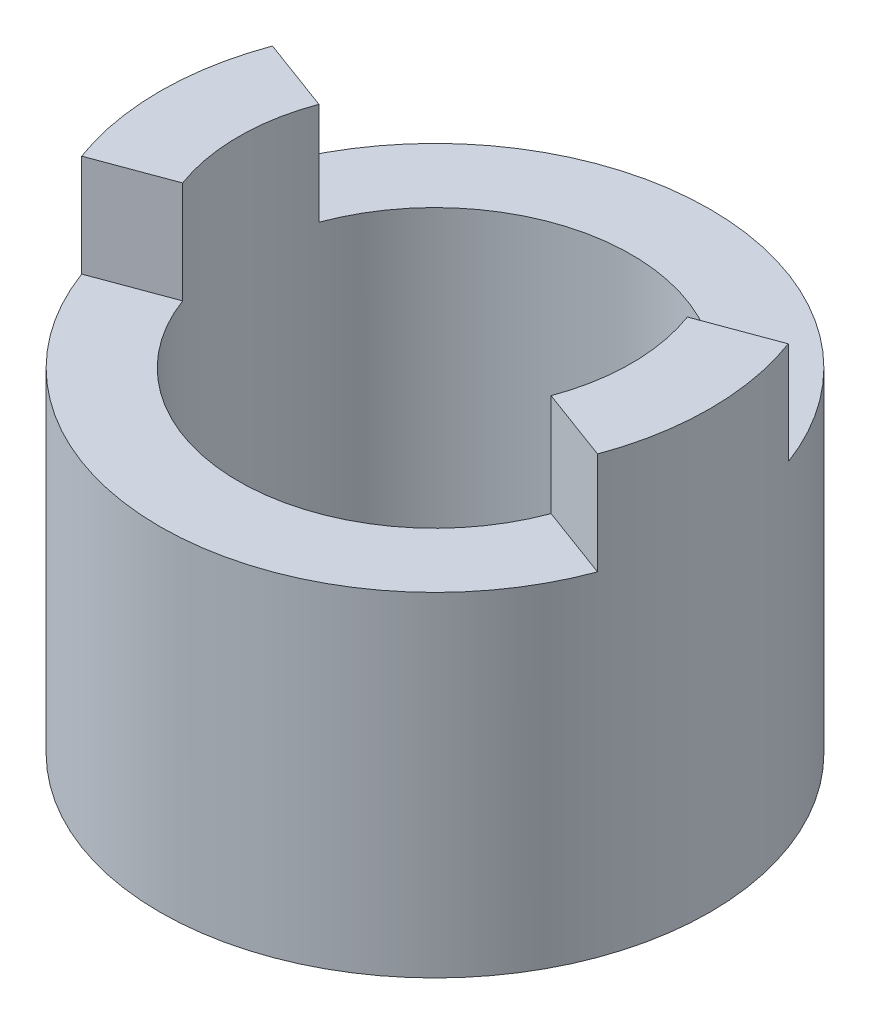
ISO-10303-21;
HEADER;
FILE_DESCRIPTION(('STEP AP214'),'2;1');
FILE_NAME('part.step','',(''),(''),'','','');
FILE_SCHEMA(('AUTOMOTIVE_DESIGN { 1 0 10303 214 1 1 1 1 }'));
ENDSEC;
DATA;
#1=APPLICATION_CONTEXT('core data for automotive mechanical design processes');
#2=APPLICATION_PROTOCOL_DEFINITION('international standard','automotive_design',2000,#1);
#3=PRODUCT_CONTEXT('',#1,'mechanical');
#4=PRODUCT('Part','Part','',(#3));
#5=PRODUCT_RELATED_PRODUCT_CATEGORY('part','',(#4));
#6=PRODUCT_DEFINITION_FORMATION('','',#4);
#7=PRODUCT_DEFINITION_CONTEXT('part definition',#1,'design');
#8=PRODUCT_DEFINITION('design','',#6,#7);
#9=PRODUCT_DEFINITION_SHAPE('','',#8);
#10=(LENGTH_UNIT() NAMED_UNIT(*) SI_UNIT(.MILLI.,.METRE.));
#11=(NAMED_UNIT(*) PLANE_ANGLE_UNIT() SI_UNIT($,.RADIAN.));
#12=(NAMED_UNIT(*) SI_UNIT($,.STERADIAN.) SOLID_ANGLE_UNIT());
#13=UNCERTAINTY_MEASURE_WITH_UNIT(LENGTH_MEASURE(1.E-05),#10,'distance_accuracy_value','');
#14=(GEOMETRIC_REPRESENTATION_CONTEXT(3) GLOBAL_UNCERTAINTY_ASSIGNED_CONTEXT((#13)) GLOBAL_UNIT_ASSIGNED_CONTEXT((#10,
#11,#12)) REPRESENTATION_CONTEXT('',''));
#15=CARTESIAN_POINT('',(0.,0.,0.));
#16=DIRECTION('',(0.,0.,1.));
#17=DIRECTION('',(1.,0.,0.));
#18=AXIS2_PLACEMENT_3D('',#15,#16,#17);
#19=CARTESIAN_POINT('',(0.,4.25,0.));
#20=DIRECTION('',(0.,1.,0.));
#21=DIRECTION('',(0.,0.,1.));
#22=AXIS2_PLACEMENT_3D('',#19,#20,#21);
#23=PLANE('',#22);
#24=CARTESIAN_POINT('',(0.,4.25,0.));
#25=DIRECTION('',(0.,1.,0.));
#26=DIRECTION('',(0.,0.,1.));
#27=AXIS2_PLACEMENT_3D('',#24,#25,#26);
#28=CIRCLE('',#27,2.5);
#29=CARTESIAN_POINT('',(-2.34475912302273,4.25,0.867239675638555));
#30=VERTEX_POINT('',#29);
#31=CARTESIAN_POINT('',(2.34475912302273,4.25,0.867239675638555));
#32=VERTEX_POINT('',#31);
#33=EDGE_CURVE('E61',#30,#32,#28,.T.);
#34=ORIENTED_EDGE('',*,*,#33,.F.);
#35=DIRECTION('',(0.937903649209093,0.,-0.346895870255422));
#36=VECTOR('',#35,1.);
#37=CARTESIAN_POINT('',(-2.34475912302273,4.25,0.867239675638555));
#38=LINE('',#37,#36);
#39=CARTESIAN_POINT('',(-3.28266277223183,4.25,1.21413554589398));
#40=VERTEX_POINT('',#39);
#41=EDGE_CURVE('E187',#40,#30,#38,.T.);
#42=ORIENTED_EDGE('',*,*,#41,.F.);
#43=CARTESIAN_POINT('',(0.,4.25,0.));
#44=DIRECTION('',(0.,1.,0.));
#45=DIRECTION('',(0.,0.,1.));
#46=AXIS2_PLACEMENT_3D('',#43,#44,#45);
#47=CIRCLE('',#46,3.5);
#48=CARTESIAN_POINT('',(3.28266277223183,4.25,1.21413554589398));
#49=VERTEX_POINT('',#48);
#50=EDGE_CURVE('E49',#40,#49,#47,.T.);
#51=ORIENTED_EDGE('',*,*,#50,.T.);
#52=DIRECTION('',(0.937903649209093,0.,0.346895870255422));
#53=VECTOR('',#52,1.);
#54=CARTESIAN_POINT('',(2.34475912302273,4.25,0.867239675638555));
#55=LINE('',#54,#53);
#56=EDGE_CURVE('E136',#32,#49,#55,.T.);
#57=ORIENTED_EDGE('',*,*,#56,.F.);
#58=EDGE_LOOP('',(#34,#42,#51,#57));
#59=FACE_BOUND('',#58,.T.);
#60=ADVANCED_FACE('F39',(#59),#23,.T.);
#61=CARTESIAN_POINT('',(3.28266277223183,4.25,-1.21413554589398));
#62=VERTEX_POINT('',#61);
#63=CARTESIAN_POINT('',(-3.28266277223183,4.25,-1.21413554589398));
#64=VERTEX_POINT('',#63);
#65=EDGE_CURVE('E11',#62,#64,#47,.T.);
#66=ORIENTED_EDGE('',*,*,#65,.T.);
#67=DIRECTION('',(-0.937903649209093,0.,-0.346895870255422));
#68=VECTOR('',#67,1.);
#69=CARTESIAN_POINT('',(-2.34475912302273,4.25,-0.867239675638555));
#70=LINE('',#69,#68);
#71=CARTESIAN_POINT('',(-2.34475912302273,4.25,-0.867239675638555));
#72=VERTEX_POINT('',#71);
#73=EDGE_CURVE('E124',#72,#64,#70,.T.);
#74=ORIENTED_EDGE('',*,*,#73,.F.);
#75=CARTESIAN_POINT('',(2.34475912302273,4.25,-0.867239675638555));
#76=VERTEX_POINT('',#75);
#77=EDGE_CURVE('E174',#76,#72,#28,.T.);
#78=ORIENTED_EDGE('',*,*,#77,.F.);
#79=DIRECTION('',(-0.937903649209093,0.,0.346895870255422));
#80=VECTOR('',#79,1.);
#81=CARTESIAN_POINT('',(2.34475912302273,4.25,-0.867239675638555));
#82=LINE('',#81,#80);
#83=EDGE_CURVE('E131',#62,#76,#82,.T.);
#84=ORIENTED_EDGE('',*,*,#83,.F.);
#85=EDGE_LOOP('',(#66,#74,#78,#84));
#86=FACE_BOUND('',#85,.T.);
#87=ADVANCED_FACE('F213',(#86),#23,.T.);
#88=CARTESIAN_POINT('',(0.,0.,0.));
#89=DIRECTION('',(0.,1.,0.));
#90=DIRECTION('',(0.,0.,1.));
#91=AXIS2_PLACEMENT_3D('',#88,#89,#90);
#92=PLANE('',#91);
#93=CARTESIAN_POINT('',(0.,0.,0.));
#94=DIRECTION('',(0.,1.,0.));
#95=DIRECTION('',(0.,0.,1.));
#96=AXIS2_PLACEMENT_3D('',#93,#94,#95);
#97=CIRCLE('',#96,3.5);
#98=CARTESIAN_POINT('',(0.,0.,3.5));
#99=VERTEX_POINT('',#98);
#100=EDGE_CURVE('E43',#99,#99,#97,.T.);
#101=ORIENTED_EDGE('',*,*,#100,.F.);
#102=EDGE_LOOP('',(#101));
#103=FACE_BOUND('',#102,.T.);
#104=CARTESIAN_POINT('',(0.,0.,0.));
#105=DIRECTION('',(0.,1.,0.));
#106=DIRECTION('',(0.,0.,1.));
#107=AXIS2_PLACEMENT_3D('',#104,#105,#106);
#108=CIRCLE('',#107,2.5);
#109=CARTESIAN_POINT('',(0.,0.,2.5));
#110=VERTEX_POINT('',#109);
#111=EDGE_CURVE('E173',#110,#110,#108,.T.);
#112=ORIENTED_EDGE('',*,*,#111,.T.);
#113=EDGE_LOOP('',(#112));
#114=FACE_BOUND('',#113,.T.);
#115=ADVANCED_FACE('F210',(#103,#114),#92,.F.);
#116=CARTESIAN_POINT('',(0.,4.25,0.));
#117=DIRECTION('',(0.,-1.,0.));
#118=DIRECTION('',(0.,0.,-1.));
#119=AXIS2_PLACEMENT_3D('',#116,#117,#118);
#120=CYLINDRICAL_SURFACE('',#119,3.5);
#121=ORIENTED_EDGE('',*,*,#65,.F.);
#122=DIRECTION('',(0.,-1.,0.));
#123=VECTOR('',#122,1.);
#124=CARTESIAN_POINT('',(3.28266277223183,5.55,-1.21413554589398));
#125=LINE('',#124,#123);
#126=CARTESIAN_POINT('',(3.28266277223183,5.55,-1.21413554589398));
#127=VERTEX_POINT('',#126);
#128=EDGE_CURVE('E169',#127,#62,#125,.T.);
#129=ORIENTED_EDGE('',*,*,#128,.F.);
#130=CARTESIAN_POINT('',(0.,5.55,0.));
#131=DIRECTION('',(0.,1.,0.));
#132=DIRECTION('',(0.,0.,1.));
#133=AXIS2_PLACEMENT_3D('',#130,#131,#132);
#134=CIRCLE('',#133,3.5);
#135=CARTESIAN_POINT('',(3.28266277223183,5.55,1.21413554589398));
#136=VERTEX_POINT('',#135);
#137=EDGE_CURVE('E142',#136,#127,#134,.T.);
#138=ORIENTED_EDGE('',*,*,#137,.F.);
#139=DIRECTION('',(0.,-1.,0.));
#140=VECTOR('',#139,1.);
#141=CARTESIAN_POINT('',(3.28266277223183,5.55,1.21413554589398));
#142=LINE('',#141,#140);
#143=EDGE_CURVE('E154',#136,#49,#142,.T.);
#144=ORIENTED_EDGE('',*,*,#143,.T.);
#145=ORIENTED_EDGE('',*,*,#50,.F.);
#146=DIRECTION('',(0.,-1.,0.));
#147=VECTOR('',#146,1.);
#148=CARTESIAN_POINT('',(-3.28266277223183,5.55,1.21413554589398));
#149=LINE('',#148,#147);
#150=CARTESIAN_POINT('',(-3.28266277223183,5.55,1.21413554589398));
#151=VERTEX_POINT('',#150);
#152=EDGE_CURVE('E109',#151,#40,#149,.T.);
#153=ORIENTED_EDGE('',*,*,#152,.F.);
#154=CARTESIAN_POINT('',(0.,5.55,0.));
#155=DIRECTION('',(0.,1.,0.));
#156=DIRECTION('',(0.,0.,1.));
#157=AXIS2_PLACEMENT_3D('',#154,#155,#156);
#158=CIRCLE('',#157,3.5);
#159=CARTESIAN_POINT('',(-3.28266277223183,5.55,-1.21413554589398));
#160=VERTEX_POINT('',#159);
#161=EDGE_CURVE('E114',#160,#151,#158,.T.);
#162=ORIENTED_EDGE('',*,*,#161,.F.);
#163=DIRECTION('',(0.,-1.,0.));
#164=VECTOR('',#163,1.);
#165=CARTESIAN_POINT('',(-3.28266277223183,5.55,-1.21413554589398));
#166=LINE('',#165,#164);
#167=EDGE_CURVE('E290',#160,#64,#166,.T.);
#168=ORIENTED_EDGE('',*,*,#167,.T.);
#169=EDGE_LOOP('',(#121,#129,#138,#144,#145,#153,#162,#168));
#170=FACE_BOUND('',#169,.T.);
#171=ORIENTED_EDGE('',*,*,#100,.T.);
#172=EDGE_LOOP('',(#171));
#173=FACE_BOUND('',#172,.T.);
#174=ADVANCED_FACE('F41',(#170,#173),#120,.T.);
#175=CARTESIAN_POINT('',(0.,4.25,0.));
#176=DIRECTION('',(0.,-1.,0.));
#177=DIRECTION('',(0.,0.,-1.));
#178=AXIS2_PLACEMENT_3D('',#175,#176,#177);
#179=CYLINDRICAL_SURFACE('',#178,2.5);
#180=ORIENTED_EDGE('',*,*,#77,.T.);
#181=DIRECTION('',(0.,-1.,0.));
#182=VECTOR('',#181,1.);
#183=CARTESIAN_POINT('',(-2.34475912302273,5.55,-0.867239675638555));
#184=LINE('',#183,#182);
#185=CARTESIAN_POINT('',(-2.34475912302273,5.55,-0.867239675638555));
#186=VERTEX_POINT('',#185);
#187=EDGE_CURVE('E138',#186,#72,#184,.T.);
#188=ORIENTED_EDGE('',*,*,#187,.F.);
#189=CARTESIAN_POINT('',(0.,5.55,0.));
#190=DIRECTION('',(0.,-1.,0.));
#191=DIRECTION('',(0.,0.,1.));
#192=AXIS2_PLACEMENT_3D('',#189,#190,#191);
#193=CIRCLE('',#192,2.5);
#194=CARTESIAN_POINT('',(-2.34475912302273,5.55,0.867239675638555));
#195=VERTEX_POINT('',#194);
#196=EDGE_CURVE('E113',#195,#186,#193,.T.);
#197=ORIENTED_EDGE('',*,*,#196,.F.);
#198=DIRECTION('',(0.,-1.,0.));
#199=VECTOR('',#198,1.);
#200=CARTESIAN_POINT('',(-2.34475912302273,5.55,0.867239675638555));
#201=LINE('',#200,#199);
#202=EDGE_CURVE('E56',#195,#30,#201,.T.);
#203=ORIENTED_EDGE('',*,*,#202,.T.);
#204=ORIENTED_EDGE('',*,*,#33,.T.);
#205=DIRECTION('',(0.,-1.,0.));
#206=VECTOR('',#205,1.);
#207=CARTESIAN_POINT('',(2.34475912302273,5.55,0.867239675638555));
#208=LINE('',#207,#206);
#209=CARTESIAN_POINT('',(2.34475912302273,5.55,0.867239675638555));
#210=VERTEX_POINT('',#209);
#211=EDGE_CURVE('E161',#210,#32,#208,.T.);
#212=ORIENTED_EDGE('',*,*,#211,.F.);
#213=CARTESIAN_POINT('',(0.,5.55,0.));
#214=DIRECTION('',(0.,-1.,0.));
#215=DIRECTION('',(0.,0.,1.));
#216=AXIS2_PLACEMENT_3D('',#213,#214,#215);
#217=CIRCLE('',#216,2.5);
#218=CARTESIAN_POINT('',(2.34475912302273,5.55,-0.867239675638555));
#219=VERTEX_POINT('',#218);
#220=EDGE_CURVE('E149',#219,#210,#217,.T.);
#221=ORIENTED_EDGE('',*,*,#220,.F.);
#222=DIRECTION('',(0.,-1.,0.));
#223=VECTOR('',#222,1.);
#224=CARTESIAN_POINT('',(2.34475912302273,5.55,-0.867239675638555));
#225=LINE('',#224,#223);
#226=EDGE_CURVE('E165',#219,#76,#225,.T.);
#227=ORIENTED_EDGE('',*,*,#226,.T.);
#228=EDGE_LOOP('',(#180,#188,#197,#203,#204,#212,#221,#227));
#229=FACE_BOUND('',#228,.T.);
#230=ORIENTED_EDGE('',*,*,#111,.F.);
#231=EDGE_LOOP('',(#230));
#232=FACE_BOUND('',#231,.T.);
#233=ADVANCED_FACE('F198',(#229,#232),#179,.F.);
#234=CARTESIAN_POINT('',(2.34475912302273,5.55,-0.867239675638555));
#235=DIRECTION('',(0.346895870255422,0.,0.937903649209093));
#236=DIRECTION('',(0.937903649209093,0.,-0.346895870255422));
#237=AXIS2_PLACEMENT_3D('',#234,#235,#236);
#238=PLANE('',#237);
#239=ORIENTED_EDGE('',*,*,#83,.T.);
#240=ORIENTED_EDGE('',*,*,#226,.F.);
#241=DIRECTION('',(-0.937903649209093,0.,0.346895870255422));
#242=VECTOR('',#241,1.);
#243=CARTESIAN_POINT('',(2.34475912302273,5.55,-0.867239675638555));
#244=LINE('',#243,#242);
#245=EDGE_CURVE('E146',#127,#219,#244,.T.);
#246=ORIENTED_EDGE('',*,*,#245,.F.);
#247=ORIENTED_EDGE('',*,*,#128,.T.);
#248=EDGE_LOOP('',(#239,#240,#246,#247));
#249=FACE_BOUND('',#248,.T.);
#250=ADVANCED_FACE('F202',(#249),#238,.F.);
#251=CARTESIAN_POINT('',(2.34475912302273,5.55,0.867239675638555));
#252=DIRECTION('',(0.346895870255422,0.,-0.937903649209093));
#253=DIRECTION('',(-0.937903649209093,0.,-0.346895870255422));
#254=AXIS2_PLACEMENT_3D('',#251,#252,#253);
#255=PLANE('',#254);
#256=ORIENTED_EDGE('',*,*,#56,.T.);
#257=ORIENTED_EDGE('',*,*,#143,.F.);
#258=DIRECTION('',(0.937903649209093,0.,0.346895870255422));
#259=VECTOR('',#258,1.);
#260=CARTESIAN_POINT('',(2.34475912302273,5.55,0.867239675638555));
#261=LINE('',#260,#259);
#262=EDGE_CURVE('E152',#210,#136,#261,.T.);
#263=ORIENTED_EDGE('',*,*,#262,.F.);
#264=ORIENTED_EDGE('',*,*,#211,.T.);
#265=EDGE_LOOP('',(#256,#257,#263,#264));
#266=FACE_BOUND('',#265,.T.);
#267=ADVANCED_FACE('F190',(#266),#255,.F.);
#268=CARTESIAN_POINT('',(0.,5.55,0.));
#269=DIRECTION('',(0.,1.,0.));
#270=DIRECTION('',(0.,0.,1.));
#271=AXIS2_PLACEMENT_3D('',#268,#269,#270);
#272=PLANE('',#271);
#273=ORIENTED_EDGE('',*,*,#137,.T.);
#274=ORIENTED_EDGE('',*,*,#245,.T.);
#275=ORIENTED_EDGE('',*,*,#220,.T.);
#276=ORIENTED_EDGE('',*,*,#262,.T.);
#277=EDGE_LOOP('',(#273,#274,#275,#276));
#278=FACE_BOUND('',#277,.T.);
#279=ADVANCED_FACE('F195',(#278),#272,.T.);
#280=CARTESIAN_POINT('',(-2.34475912302273,5.55,0.867239675638555));
#281=DIRECTION('',(-0.346895870255422,0.,-0.937903649209093));
#282=DIRECTION('',(-0.937903649209093,0.,0.346895870255422));
#283=AXIS2_PLACEMENT_3D('',#280,#281,#282);
#284=PLANE('',#283);
#285=ORIENTED_EDGE('',*,*,#41,.T.);
#286=ORIENTED_EDGE('',*,*,#202,.F.);
#287=DIRECTION('',(0.937903649209093,0.,-0.346895870255422));
#288=VECTOR('',#287,1.);
#289=CARTESIAN_POINT('',(-2.34475912302273,5.55,0.867239675638555));
#290=LINE('',#289,#288);
#291=EDGE_CURVE('E105',#151,#195,#290,.T.);
#292=ORIENTED_EDGE('',*,*,#291,.F.);
#293=ORIENTED_EDGE('',*,*,#152,.T.);
#294=EDGE_LOOP('',(#285,#286,#292,#293));
#295=FACE_BOUND('',#294,.T.);
#296=ADVANCED_FACE('F107',(#295),#284,.F.);
#297=CARTESIAN_POINT('',(-2.34475912302273,5.55,-0.867239675638555));
#298=DIRECTION('',(-0.346895870255422,0.,0.937903649209093));
#299=DIRECTION('',(0.937903649209093,0.,0.346895870255422));
#300=AXIS2_PLACEMENT_3D('',#297,#298,#299);
#301=PLANE('',#300);
#302=ORIENTED_EDGE('',*,*,#73,.T.);
#303=ORIENTED_EDGE('',*,*,#167,.F.);
#304=DIRECTION('',(-0.937903649209093,0.,-0.346895870255422));
#305=VECTOR('',#304,1.);
#306=CARTESIAN_POINT('',(-2.34475912302273,5.55,-0.867239675638555));
#307=LINE('',#306,#305);
#308=EDGE_CURVE('E119',#186,#160,#307,.T.);
#309=ORIENTED_EDGE('',*,*,#308,.F.);
#310=ORIENTED_EDGE('',*,*,#187,.T.);
#311=EDGE_LOOP('',(#302,#303,#309,#310));
#312=FACE_BOUND('',#311,.T.);
#313=ADVANCED_FACE('F268',(#312),#301,.F.);
#314=CARTESIAN_POINT('',(0.,5.55,0.));
#315=DIRECTION('',(0.,1.,0.));
#316=DIRECTION('',(0.,0.,1.));
#317=AXIS2_PLACEMENT_3D('',#314,#315,#316);
#318=PLANE('',#317);
#319=ORIENTED_EDGE('',*,*,#161,.T.);
#320=ORIENTED_EDGE('',*,*,#291,.T.);
#321=ORIENTED_EDGE('',*,*,#196,.T.);
#322=ORIENTED_EDGE('',*,*,#308,.T.);
#323=EDGE_LOOP('',(#319,#320,#321,#322));
#324=FACE_BOUND('',#323,.T.);
#325=ADVANCED_FACE('F117',(#324),#318,.T.);
#326=CLOSED_SHELL('',(#60,#87,#115,#174,#233,#250,#267,#279,#296,#313,#325));
#327=MANIFOLD_SOLID_BREP('B2',#326);
#328=ADVANCED_BREP_SHAPE_REPRESENTATION('',(#18,#327),#14);
#329=SHAPE_DEFINITION_REPRESENTATION(#9,#328);
ENDSEC;
END-ISO-10303-21;
